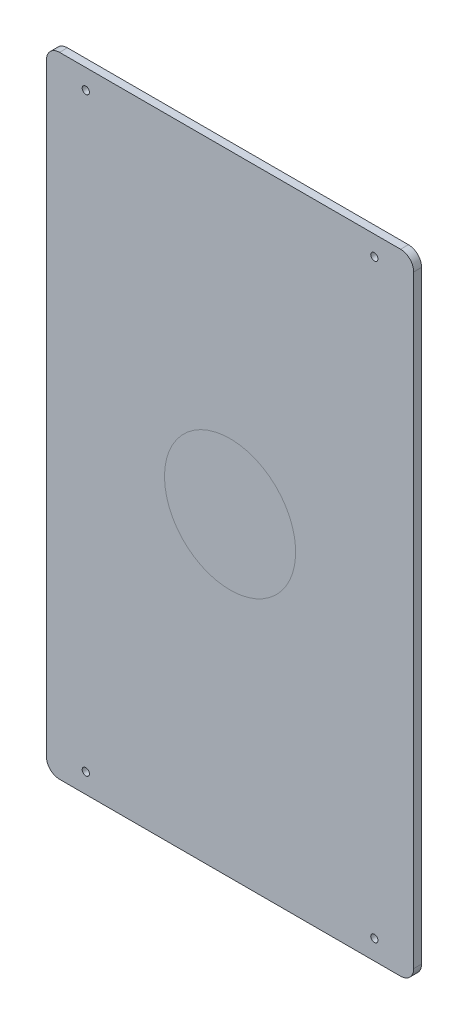
ISO-10303-21;
HEADER;
FILE_DESCRIPTION(('STEP AP214'),'2;1');
FILE_NAME('part.step','',(''),(''),'','','');
FILE_SCHEMA(('AUTOMOTIVE_DESIGN { 1 0 10303 214 1 1 1 1 }'));
ENDSEC;
DATA;
#1=APPLICATION_CONTEXT('core data for automotive mechanical design processes');
#2=APPLICATION_PROTOCOL_DEFINITION('international standard','automotive_design',2000,#1);
#3=PRODUCT_CONTEXT('',#1,'mechanical');
#4=PRODUCT('Part','Part','',(#3));
#5=PRODUCT_RELATED_PRODUCT_CATEGORY('part','',(#4));
#6=PRODUCT_DEFINITION_FORMATION('','',#4);
#7=PRODUCT_DEFINITION_CONTEXT('part definition',#1,'design');
#8=PRODUCT_DEFINITION('design','',#6,#7);
#9=PRODUCT_DEFINITION_SHAPE('','',#8);
#10=(LENGTH_UNIT() NAMED_UNIT(*) SI_UNIT(.MILLI.,.METRE.));
#11=(NAMED_UNIT(*) PLANE_ANGLE_UNIT() SI_UNIT($,.RADIAN.));
#12=(NAMED_UNIT(*) SI_UNIT($,.STERADIAN.) SOLID_ANGLE_UNIT());
#13=UNCERTAINTY_MEASURE_WITH_UNIT(LENGTH_MEASURE(1.E-05),#10,'distance_accuracy_value','');
#14=(GEOMETRIC_REPRESENTATION_CONTEXT(3) GLOBAL_UNCERTAINTY_ASSIGNED_CONTEXT((#13)) GLOBAL_UNIT_ASSIGNED_CONTEXT((#10,
#11,#12)) REPRESENTATION_CONTEXT('',''));
#15=CARTESIAN_POINT('',(0.,0.,0.));
#16=DIRECTION('',(0.,0.,1.));
#17=DIRECTION('',(1.,0.,0.));
#18=AXIS2_PLACEMENT_3D('',#15,#16,#17);
#19=CARTESIAN_POINT('',(0.,0.,6.));
#20=DIRECTION('',(0.,0.,-1.));
#21=DIRECTION('',(-1.,0.,0.));
#22=AXIS2_PLACEMENT_3D('',#19,#20,#21);
#23=PLANE('',#22);
#24=DIRECTION('',(1.,0.,0.));
#25=VECTOR('',#24,1.);
#26=CARTESIAN_POINT('',(-29.9999999999999,-465.,6.));
#27=LINE('',#26,#25);
#28=CARTESIAN_POINT('',(-19.9999999999999,-465.,6.));
#29=VERTEX_POINT('',#28);
#30=CARTESIAN_POINT('',(240.,-465.,6.));
#31=VERTEX_POINT('',#30);
#32=EDGE_CURVE('E181',#29,#31,#27,.T.);
#33=ORIENTED_EDGE('',*,*,#32,.T.);
#34=CARTESIAN_POINT('',(240.,-455.,6.));
#35=DIRECTION('',(0.,0.,-1.));
#36=DIRECTION('',(-1.,0.,0.));
#37=AXIS2_PLACEMENT_3D('',#34,#35,#36);
#38=CIRCLE('',#37,10.);
#39=CARTESIAN_POINT('',(250.,-455.,6.));
#40=VERTEX_POINT('',#39);
#41=EDGE_CURVE('E154',#31,#40,#38,.F.);
#42=ORIENTED_EDGE('',*,*,#41,.T.);
#43=DIRECTION('',(0.,1.,0.));
#44=VECTOR('',#43,1.);
#45=CARTESIAN_POINT('',(250.,15.,6.));
#46=LINE('',#45,#44);
#47=CARTESIAN_POINT('',(250.,5.,6.));
#48=VERTEX_POINT('',#47);
#49=EDGE_CURVE('E125',#40,#48,#46,.T.);
#50=ORIENTED_EDGE('',*,*,#49,.T.);
#51=CARTESIAN_POINT('',(240.,5.,6.));
#52=DIRECTION('',(0.,0.,-1.));
#53=DIRECTION('',(-1.,0.,0.));
#54=AXIS2_PLACEMENT_3D('',#51,#52,#53);
#55=CIRCLE('',#54,10.);
#56=CARTESIAN_POINT('',(240.,15.,6.));
#57=VERTEX_POINT('',#56);
#58=EDGE_CURVE('E149',#48,#57,#55,.F.);
#59=ORIENTED_EDGE('',*,*,#58,.T.);
#60=DIRECTION('',(-1.,0.,0.));
#61=VECTOR('',#60,1.);
#62=CARTESIAN_POINT('',(-30.,15.,6.));
#63=LINE('',#62,#61);
#64=CARTESIAN_POINT('',(-20.,15.,6.));
#65=VERTEX_POINT('',#64);
#66=EDGE_CURVE('E132',#57,#65,#63,.T.);
#67=ORIENTED_EDGE('',*,*,#66,.T.);
#68=CARTESIAN_POINT('',(-20.,5.,6.));
#69=DIRECTION('',(0.,0.,-1.));
#70=DIRECTION('',(-1.,0.,0.));
#71=AXIS2_PLACEMENT_3D('',#68,#69,#70);
#72=CIRCLE('',#71,10.);
#73=CARTESIAN_POINT('',(-30.,5.,6.));
#74=VERTEX_POINT('',#73);
#75=EDGE_CURVE('E60',#65,#74,#72,.F.);
#76=ORIENTED_EDGE('',*,*,#75,.T.);
#77=DIRECTION('',(0.,-1.,0.));
#78=VECTOR('',#77,1.);
#79=CARTESIAN_POINT('',(-30.,15.,6.));
#80=LINE('',#79,#78);
#81=CARTESIAN_POINT('',(-29.9999999999999,-455.,6.));
#82=VERTEX_POINT('',#81);
#83=EDGE_CURVE('E135',#74,#82,#80,.T.);
#84=ORIENTED_EDGE('',*,*,#83,.T.);
#85=CARTESIAN_POINT('',(-19.9999999999999,-455.,6.));
#86=DIRECTION('',(0.,0.,-1.));
#87=DIRECTION('',(-1.,0.,0.));
#88=AXIS2_PLACEMENT_3D('',#85,#86,#87);
#89=CIRCLE('',#88,10.);
#90=EDGE_CURVE('E152',#82,#29,#89,.F.);
#91=ORIENTED_EDGE('',*,*,#90,.T.);
#92=EDGE_LOOP('',(#33,#42,#50,#59,#67,#76,#84,#91));
#93=FACE_BOUND('',#92,.T.);
#94=CARTESIAN_POINT('',(0.,0.,6.));
#95=DIRECTION('',(0.,0.,1.));
#96=DIRECTION('',(1.,0.,0.));
#97=AXIS2_PLACEMENT_3D('',#94,#95,#96);
#98=CIRCLE('',#97,2.75);
#99=CARTESIAN_POINT('',(2.75,0.,6.));
#100=VERTEX_POINT('',#99);
#101=EDGE_CURVE('E177',#100,#100,#98,.T.);
#102=ORIENTED_EDGE('',*,*,#101,.F.);
#103=EDGE_LOOP('',(#102));
#104=FACE_BOUND('',#103,.T.);
#105=CARTESIAN_POINT('',(220.,0.,6.));
#106=DIRECTION('',(0.,0.,1.));
#107=DIRECTION('',(1.,0.,0.));
#108=AXIS2_PLACEMENT_3D('',#105,#106,#107);
#109=CIRCLE('',#108,2.75000000000001);
#110=CARTESIAN_POINT('',(222.75,0.,6.));
#111=VERTEX_POINT('',#110);
#112=EDGE_CURVE('E187',#111,#111,#109,.T.);
#113=ORIENTED_EDGE('',*,*,#112,.F.);
#114=EDGE_LOOP('',(#113));
#115=FACE_BOUND('',#114,.T.);
#116=CARTESIAN_POINT('',(220.,-450.,6.));
#117=DIRECTION('',(0.,0.,1.));
#118=DIRECTION('',(1.,0.,0.));
#119=AXIS2_PLACEMENT_3D('',#116,#117,#118);
#120=CIRCLE('',#119,2.75000000000001);
#121=CARTESIAN_POINT('',(222.75,-450.,6.));
#122=VERTEX_POINT('',#121);
#123=EDGE_CURVE('E193',#122,#122,#120,.T.);
#124=ORIENTED_EDGE('',*,*,#123,.F.);
#125=EDGE_LOOP('',(#124));
#126=FACE_BOUND('',#125,.T.);
#127=CARTESIAN_POINT('',(0.,-450.,6.));
#128=DIRECTION('',(0.,0.,1.));
#129=DIRECTION('',(1.,0.,0.));
#130=AXIS2_PLACEMENT_3D('',#127,#128,#129);
#131=CIRCLE('',#130,2.75);
#132=CARTESIAN_POINT('',(2.75000000000006,-450.,6.));
#133=VERTEX_POINT('',#132);
#134=EDGE_CURVE('E199',#133,#133,#131,.T.);
#135=ORIENTED_EDGE('',*,*,#134,.F.);
#136=EDGE_LOOP('',(#135));
#137=FACE_BOUND('',#136,.T.);
#138=CARTESIAN_POINT('',(110.,-225.,6.));
#139=DIRECTION('',(0.,0.,-1.));
#140=DIRECTION('',(-1.,0.,0.));
#141=AXIS2_PLACEMENT_3D('',#138,#139,#140);
#142=CIRCLE('',#141,50.);
#143=CARTESIAN_POINT('',(60.,-225.,6.));
#144=VERTEX_POINT('',#143);
#145=EDGE_CURVE('E11',#144,#144,#142,.F.);
#146=ORIENTED_EDGE('',*,*,#145,.F.);
#147=EDGE_LOOP('',(#146));
#148=FACE_BOUND('',#147,.T.);
#149=ADVANCED_FACE('F37',(#93,#104,#115,#126,#137,#148),#23,.F.);
#150=ORIENTED_EDGE('',*,*,#145,.T.);
#151=EDGE_LOOP('',(#150));
#152=FACE_BOUND('',#151,.T.);
#153=ADVANCED_FACE('F213',(#152),#23,.F.);
#154=CARTESIAN_POINT('',(0.,0.,0.));
#155=DIRECTION('',(0.,0.,-1.));
#156=DIRECTION('',(-1.,0.,0.));
#157=AXIS2_PLACEMENT_3D('',#154,#155,#156);
#158=PLANE('',#157);
#159=CARTESIAN_POINT('',(220.,-450.,0.));
#160=DIRECTION('',(0.,0.,1.));
#161=DIRECTION('',(1.,0.,0.));
#162=AXIS2_PLACEMENT_3D('',#159,#160,#161);
#163=CIRCLE('',#162,2.75000000000001);
#164=CARTESIAN_POINT('',(222.75,-450.,0.));
#165=VERTEX_POINT('',#164);
#166=EDGE_CURVE('E196',#165,#165,#163,.T.);
#167=ORIENTED_EDGE('',*,*,#166,.T.);
#168=EDGE_LOOP('',(#167));
#169=FACE_BOUND('',#168,.T.);
#170=CARTESIAN_POINT('',(0.,0.,0.));
#171=DIRECTION('',(0.,0.,1.));
#172=DIRECTION('',(1.,0.,0.));
#173=AXIS2_PLACEMENT_3D('',#170,#171,#172);
#174=CIRCLE('',#173,2.75);
#175=CARTESIAN_POINT('',(2.75,0.,0.));
#176=VERTEX_POINT('',#175);
#177=EDGE_CURVE('E184',#176,#176,#174,.T.);
#178=ORIENTED_EDGE('',*,*,#177,.T.);
#179=EDGE_LOOP('',(#178));
#180=FACE_BOUND('',#179,.T.);
#181=DIRECTION('',(0.,1.,0.));
#182=VECTOR('',#181,1.);
#183=CARTESIAN_POINT('',(250.,15.,0.));
#184=LINE('',#183,#182);
#185=CARTESIAN_POINT('',(250.,-455.,0.));
#186=VERTEX_POINT('',#185);
#187=CARTESIAN_POINT('',(250.,5.,0.));
#188=VERTEX_POINT('',#187);
#189=EDGE_CURVE('E122',#186,#188,#184,.T.);
#190=ORIENTED_EDGE('',*,*,#189,.F.);
#191=CARTESIAN_POINT('',(240.,-455.,0.));
#192=DIRECTION('',(0.,0.,-1.));
#193=DIRECTION('',(-1.,0.,0.));
#194=AXIS2_PLACEMENT_3D('',#191,#192,#193);
#195=CIRCLE('',#194,10.);
#196=CARTESIAN_POINT('',(240.,-465.,0.));
#197=VERTEX_POINT('',#196);
#198=EDGE_CURVE('E105',#186,#197,#195,.T.);
#199=ORIENTED_EDGE('',*,*,#198,.T.);
#200=DIRECTION('',(1.,0.,0.));
#201=VECTOR('',#200,1.);
#202=CARTESIAN_POINT('',(-29.9999999999999,-465.,0.));
#203=LINE('',#202,#201);
#204=CARTESIAN_POINT('',(-19.9999999999999,-465.,0.));
#205=VERTEX_POINT('',#204);
#206=EDGE_CURVE('E133',#205,#197,#203,.T.);
#207=ORIENTED_EDGE('',*,*,#206,.F.);
#208=CARTESIAN_POINT('',(-19.9999999999999,-455.,0.));
#209=DIRECTION('',(0.,0.,-1.));
#210=DIRECTION('',(-1.,0.,0.));
#211=AXIS2_PLACEMENT_3D('',#208,#209,#210);
#212=CIRCLE('',#211,10.);
#213=CARTESIAN_POINT('',(-29.9999999999999,-455.,0.));
#214=VERTEX_POINT('',#213);
#215=EDGE_CURVE('E116',#205,#214,#212,.T.);
#216=ORIENTED_EDGE('',*,*,#215,.T.);
#217=DIRECTION('',(0.,-1.,0.));
#218=VECTOR('',#217,1.);
#219=CARTESIAN_POINT('',(-30.,15.,0.));
#220=LINE('',#219,#218);
#221=CARTESIAN_POINT('',(-30.,5.,0.));
#222=VERTEX_POINT('',#221);
#223=EDGE_CURVE('E137',#222,#214,#220,.T.);
#224=ORIENTED_EDGE('',*,*,#223,.F.);
#225=CARTESIAN_POINT('',(-20.,5.,0.));
#226=DIRECTION('',(0.,0.,-1.));
#227=DIRECTION('',(-1.,0.,0.));
#228=AXIS2_PLACEMENT_3D('',#225,#226,#227);
#229=CIRCLE('',#228,10.);
#230=CARTESIAN_POINT('',(-20.,15.,0.));
#231=VERTEX_POINT('',#230);
#232=EDGE_CURVE('E143',#222,#231,#229,.T.);
#233=ORIENTED_EDGE('',*,*,#232,.T.);
#234=DIRECTION('',(-1.,0.,0.));
#235=VECTOR('',#234,1.);
#236=CARTESIAN_POINT('',(-30.,15.,0.));
#237=LINE('',#236,#235);
#238=CARTESIAN_POINT('',(240.,15.,0.));
#239=VERTEX_POINT('',#238);
#240=EDGE_CURVE('E168',#239,#231,#237,.T.);
#241=ORIENTED_EDGE('',*,*,#240,.F.);
#242=CARTESIAN_POINT('',(240.,5.,0.));
#243=DIRECTION('',(0.,0.,-1.));
#244=DIRECTION('',(-1.,0.,0.));
#245=AXIS2_PLACEMENT_3D('',#242,#243,#244);
#246=CIRCLE('',#245,10.);
#247=EDGE_CURVE('E126',#239,#188,#246,.T.);
#248=ORIENTED_EDGE('',*,*,#247,.T.);
#249=EDGE_LOOP('',(#190,#199,#207,#216,#224,#233,#241,#248));
#250=FACE_BOUND('',#249,.T.);
#251=CARTESIAN_POINT('',(220.,0.,0.));
#252=DIRECTION('',(0.,0.,1.));
#253=DIRECTION('',(1.,0.,0.));
#254=AXIS2_PLACEMENT_3D('',#251,#252,#253);
#255=CIRCLE('',#254,2.75000000000001);
#256=CARTESIAN_POINT('',(222.75,0.,0.));
#257=VERTEX_POINT('',#256);
#258=EDGE_CURVE('E190',#257,#257,#255,.T.);
#259=ORIENTED_EDGE('',*,*,#258,.T.);
#260=EDGE_LOOP('',(#259));
#261=FACE_BOUND('',#260,.T.);
#262=CARTESIAN_POINT('',(0.,-450.,0.));
#263=DIRECTION('',(0.,0.,1.));
#264=DIRECTION('',(1.,0.,0.));
#265=AXIS2_PLACEMENT_3D('',#262,#263,#264);
#266=CIRCLE('',#265,2.75);
#267=CARTESIAN_POINT('',(2.75000000000006,-450.,0.));
#268=VERTEX_POINT('',#267);
#269=EDGE_CURVE('E202',#268,#268,#266,.T.);
#270=ORIENTED_EDGE('',*,*,#269,.T.);
#271=EDGE_LOOP('',(#270));
#272=FACE_BOUND('',#271,.T.);
#273=ADVANCED_FACE('F129',(#169,#180,#250,#261,#272),#158,.T.);
#274=CARTESIAN_POINT('',(-30.,15.,6.));
#275=DIRECTION('',(0.,-1.,0.));
#276=DIRECTION('',(0.,0.,-1.));
#277=AXIS2_PLACEMENT_3D('',#274,#275,#276);
#278=PLANE('',#277);
#279=ORIENTED_EDGE('',*,*,#240,.T.);
#280=DIRECTION('',(0.,0.,-1.));
#281=VECTOR('',#280,1.);
#282=CARTESIAN_POINT('',(-20.,15.,6.));
#283=LINE('',#282,#281);
#284=EDGE_CURVE('E46',#231,#65,#283,.F.);
#285=ORIENTED_EDGE('',*,*,#284,.T.);
#286=ORIENTED_EDGE('',*,*,#66,.F.);
#287=DIRECTION('',(0.,0.,-1.));
#288=VECTOR('',#287,1.);
#289=CARTESIAN_POINT('',(240.,15.,6.));
#290=LINE('',#289,#288);
#291=EDGE_CURVE('E160',#57,#239,#290,.T.);
#292=ORIENTED_EDGE('',*,*,#291,.T.);
#293=EDGE_LOOP('',(#279,#285,#286,#292));
#294=FACE_BOUND('',#293,.T.);
#295=ADVANCED_FACE('F166',(#294),#278,.F.);
#296=CARTESIAN_POINT('',(-30.,15.,6.));
#297=DIRECTION('',(1.,0.,0.));
#298=DIRECTION('',(0.,1.,0.));
#299=AXIS2_PLACEMENT_3D('',#296,#297,#298);
#300=PLANE('',#299);
#301=ORIENTED_EDGE('',*,*,#223,.T.);
#302=DIRECTION('',(0.,0.,-1.));
#303=VECTOR('',#302,1.);
#304=CARTESIAN_POINT('',(-29.9999999999999,-455.,6.));
#305=LINE('',#304,#303);
#306=EDGE_CURVE('E53',#214,#82,#305,.F.);
#307=ORIENTED_EDGE('',*,*,#306,.T.);
#308=ORIENTED_EDGE('',*,*,#83,.F.);
#309=DIRECTION('',(0.,0.,-1.));
#310=VECTOR('',#309,1.);
#311=CARTESIAN_POINT('',(-30.,5.,6.));
#312=LINE('',#311,#310);
#313=EDGE_CURVE('E156',#74,#222,#312,.T.);
#314=ORIENTED_EDGE('',*,*,#313,.T.);
#315=EDGE_LOOP('',(#301,#307,#308,#314));
#316=FACE_BOUND('',#315,.T.);
#317=ADVANCED_FACE('F176',(#316),#300,.F.);
#318=CARTESIAN_POINT('',(-29.9999999999999,-465.,6.));
#319=DIRECTION('',(0.,1.,0.));
#320=DIRECTION('',(0.,0.,1.));
#321=AXIS2_PLACEMENT_3D('',#318,#319,#320);
#322=PLANE('',#321);
#323=ORIENTED_EDGE('',*,*,#206,.T.);
#324=DIRECTION('',(0.,0.,-1.));
#325=VECTOR('',#324,1.);
#326=CARTESIAN_POINT('',(240.,-465.,6.));
#327=LINE('',#326,#325);
#328=EDGE_CURVE('E110',#197,#31,#327,.F.);
#329=ORIENTED_EDGE('',*,*,#328,.T.);
#330=ORIENTED_EDGE('',*,*,#32,.F.);
#331=DIRECTION('',(0.,0.,-1.));
#332=VECTOR('',#331,1.);
#333=CARTESIAN_POINT('',(-19.9999999999999,-465.,6.));
#334=LINE('',#333,#332);
#335=EDGE_CURVE('E115',#29,#205,#334,.T.);
#336=ORIENTED_EDGE('',*,*,#335,.T.);
#337=EDGE_LOOP('',(#323,#329,#330,#336));
#338=FACE_BOUND('',#337,.T.);
#339=ADVANCED_FACE('F229',(#338),#322,.F.);
#340=CARTESIAN_POINT('',(250.,15.,6.));
#341=DIRECTION('',(-1.,0.,0.));
#342=DIRECTION('',(0.,-1.,0.));
#343=AXIS2_PLACEMENT_3D('',#340,#341,#342);
#344=PLANE('',#343);
#345=ORIENTED_EDGE('',*,*,#49,.F.);
#346=DIRECTION('',(0.,0.,-1.));
#347=VECTOR('',#346,1.);
#348=CARTESIAN_POINT('',(250.,-455.,6.));
#349=LINE('',#348,#347);
#350=EDGE_CURVE('E109',#40,#186,#349,.T.);
#351=ORIENTED_EDGE('',*,*,#350,.T.);
#352=ORIENTED_EDGE('',*,*,#189,.T.);
#353=DIRECTION('',(0.,0.,-1.));
#354=VECTOR('',#353,1.);
#355=CARTESIAN_POINT('',(250.,5.,6.));
#356=LINE('',#355,#354);
#357=EDGE_CURVE('E127',#188,#48,#356,.F.);
#358=ORIENTED_EDGE('',*,*,#357,.T.);
#359=EDGE_LOOP('',(#345,#351,#352,#358));
#360=FACE_BOUND('',#359,.T.);
#361=ADVANCED_FACE('F121',(#360),#344,.F.);
#362=CARTESIAN_POINT('',(0.,0.,6.));
#363=DIRECTION('',(0.,0.,-1.));
#364=DIRECTION('',(-1.,0.,0.));
#365=AXIS2_PLACEMENT_3D('',#362,#363,#364);
#366=CYLINDRICAL_SURFACE('',#365,2.75);
#367=ORIENTED_EDGE('',*,*,#101,.T.);
#368=EDGE_LOOP('',(#367));
#369=FACE_BOUND('',#368,.T.);
#370=ORIENTED_EDGE('',*,*,#177,.F.);
#371=EDGE_LOOP('',(#370));
#372=FACE_BOUND('',#371,.T.);
#373=ADVANCED_FACE('F224',(#369,#372),#366,.F.);
#374=CARTESIAN_POINT('',(220.,0.,6.));
#375=DIRECTION('',(0.,0.,-1.));
#376=DIRECTION('',(-1.,0.,0.));
#377=AXIS2_PLACEMENT_3D('',#374,#375,#376);
#378=CYLINDRICAL_SURFACE('',#377,2.75000000000001);
#379=ORIENTED_EDGE('',*,*,#112,.T.);
#380=EDGE_LOOP('',(#379));
#381=FACE_BOUND('',#380,.T.);
#382=ORIENTED_EDGE('',*,*,#258,.F.);
#383=EDGE_LOOP('',(#382));
#384=FACE_BOUND('',#383,.T.);
#385=ADVANCED_FACE('F331',(#381,#384),#378,.F.);
#386=CARTESIAN_POINT('',(220.,-450.,6.));
#387=DIRECTION('',(0.,0.,-1.));
#388=DIRECTION('',(-1.,0.,0.));
#389=AXIS2_PLACEMENT_3D('',#386,#387,#388);
#390=CYLINDRICAL_SURFACE('',#389,2.75000000000001);
#391=ORIENTED_EDGE('',*,*,#123,.T.);
#392=EDGE_LOOP('',(#391));
#393=FACE_BOUND('',#392,.T.);
#394=ORIENTED_EDGE('',*,*,#166,.F.);
#395=EDGE_LOOP('',(#394));
#396=FACE_BOUND('',#395,.T.);
#397=ADVANCED_FACE('F322',(#393,#396),#390,.F.);
#398=CARTESIAN_POINT('',(0.,-450.,6.));
#399=DIRECTION('',(0.,0.,-1.));
#400=DIRECTION('',(-1.,0.,0.));
#401=AXIS2_PLACEMENT_3D('',#398,#399,#400);
#402=CYLINDRICAL_SURFACE('',#401,2.75);
#403=ORIENTED_EDGE('',*,*,#134,.T.);
#404=EDGE_LOOP('',(#403));
#405=FACE_BOUND('',#404,.T.);
#406=ORIENTED_EDGE('',*,*,#269,.F.);
#407=EDGE_LOOP('',(#406));
#408=FACE_BOUND('',#407,.T.);
#409=ADVANCED_FACE('F208',(#405,#408),#402,.F.);
#410=CARTESIAN_POINT('',(240.,-455.,6.));
#411=DIRECTION('',(0.,0.,-1.));
#412=DIRECTION('',(-1.,0.,0.));
#413=AXIS2_PLACEMENT_3D('',#410,#411,#412);
#414=CYLINDRICAL_SURFACE('',#413,10.);
#415=ORIENTED_EDGE('',*,*,#41,.F.);
#416=ORIENTED_EDGE('',*,*,#328,.F.);
#417=ORIENTED_EDGE('',*,*,#198,.F.);
#418=ORIENTED_EDGE('',*,*,#350,.F.);
#419=EDGE_LOOP('',(#415,#416,#417,#418));
#420=FACE_BOUND('',#419,.T.);
#421=ADVANCED_FACE('F108',(#420),#414,.T.);
#422=CARTESIAN_POINT('',(-19.9999999999999,-455.,6.));
#423=DIRECTION('',(0.,0.,-1.));
#424=DIRECTION('',(-1.,0.,0.));
#425=AXIS2_PLACEMENT_3D('',#422,#423,#424);
#426=CYLINDRICAL_SURFACE('',#425,10.);
#427=ORIENTED_EDGE('',*,*,#90,.F.);
#428=ORIENTED_EDGE('',*,*,#306,.F.);
#429=ORIENTED_EDGE('',*,*,#215,.F.);
#430=ORIENTED_EDGE('',*,*,#335,.F.);
#431=EDGE_LOOP('',(#427,#428,#429,#430));
#432=FACE_BOUND('',#431,.T.);
#433=ADVANCED_FACE('F239',(#432),#426,.T.);
#434=CARTESIAN_POINT('',(-20.,5.,6.));
#435=DIRECTION('',(0.,0.,-1.));
#436=DIRECTION('',(-1.,0.,0.));
#437=AXIS2_PLACEMENT_3D('',#434,#435,#436);
#438=CYLINDRICAL_SURFACE('',#437,10.);
#439=ORIENTED_EDGE('',*,*,#75,.F.);
#440=ORIENTED_EDGE('',*,*,#284,.F.);
#441=ORIENTED_EDGE('',*,*,#232,.F.);
#442=ORIENTED_EDGE('',*,*,#313,.F.);
#443=EDGE_LOOP('',(#439,#440,#441,#442));
#444=FACE_BOUND('',#443,.T.);
#445=ADVANCED_FACE('F174',(#444),#438,.T.);
#446=CARTESIAN_POINT('',(240.,5.,6.));
#447=DIRECTION('',(0.,0.,-1.));
#448=DIRECTION('',(-1.,0.,0.));
#449=AXIS2_PLACEMENT_3D('',#446,#447,#448);
#450=CYLINDRICAL_SURFACE('',#449,10.);
#451=ORIENTED_EDGE('',*,*,#58,.F.);
#452=ORIENTED_EDGE('',*,*,#357,.F.);
#453=ORIENTED_EDGE('',*,*,#247,.F.);
#454=ORIENTED_EDGE('',*,*,#291,.F.);
#455=EDGE_LOOP('',(#451,#452,#453,#454));
#456=FACE_BOUND('',#455,.T.);
#457=ADVANCED_FACE('F39',(#456),#450,.T.);
#458=CLOSED_SHELL('',(#149,#153,#273,#295,#317,#339,#361,#373,#385,#397,#409,#421,#433,#445,#457));
#459=MANIFOLD_SOLID_BREP('B2',#458);
#460=ADVANCED_BREP_SHAPE_REPRESENTATION('',(#18,#459),#14);
#461=SHAPE_DEFINITION_REPRESENTATION(#9,#460);
ENDSEC;
END-ISO-10303-21;
